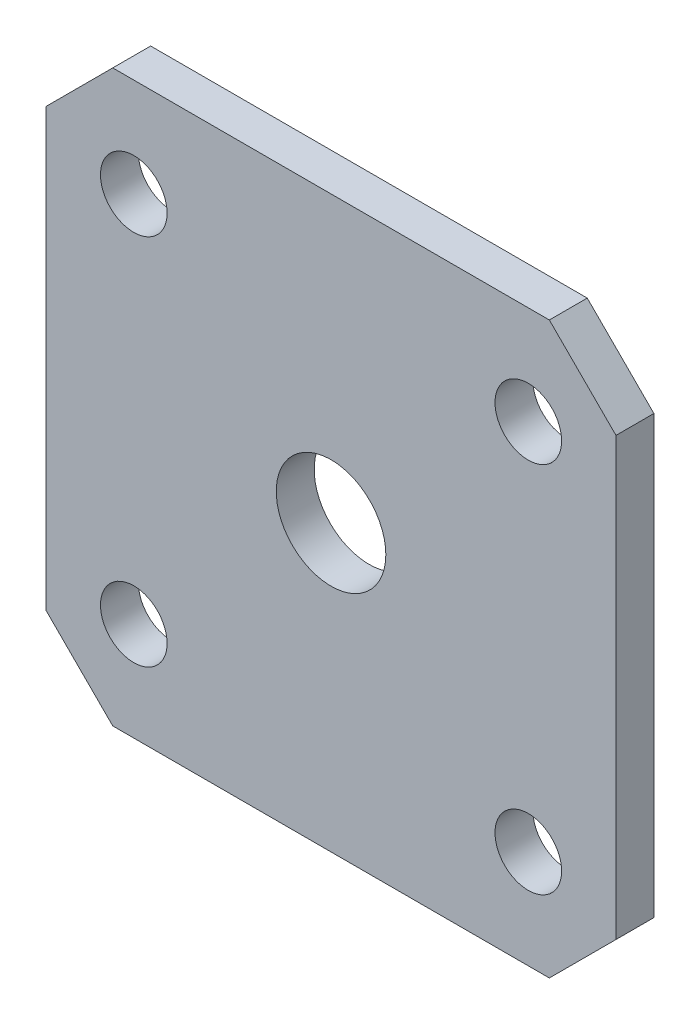
ISO-10303-21;
HEADER;
FILE_DESCRIPTION(('STEP AP214'),'2;1');
FILE_NAME('part.step','',(''),(''),'','','');
FILE_SCHEMA(('AUTOMOTIVE_DESIGN { 1 0 10303 214 1 1 1 1 }'));
ENDSEC;
DATA;
#1=APPLICATION_CONTEXT('core data for automotive mechanical design processes');
#2=APPLICATION_PROTOCOL_DEFINITION('international standard','automotive_design',2000,#1);
#3=PRODUCT_CONTEXT('',#1,'mechanical');
#4=PRODUCT('Part','Part','',(#3));
#5=PRODUCT_RELATED_PRODUCT_CATEGORY('part','',(#4));
#6=PRODUCT_DEFINITION_FORMATION('','',#4);
#7=PRODUCT_DEFINITION_CONTEXT('part definition',#1,'design');
#8=PRODUCT_DEFINITION('design','',#6,#7);
#9=PRODUCT_DEFINITION_SHAPE('','',#8);
#10=(LENGTH_UNIT() NAMED_UNIT(*) SI_UNIT(.MILLI.,.METRE.));
#11=(NAMED_UNIT(*) PLANE_ANGLE_UNIT() SI_UNIT($,.RADIAN.));
#12=(NAMED_UNIT(*) SI_UNIT($,.STERADIAN.) SOLID_ANGLE_UNIT());
#13=UNCERTAINTY_MEASURE_WITH_UNIT(LENGTH_MEASURE(1.E-05),#10,'distance_accuracy_value','');
#14=(GEOMETRIC_REPRESENTATION_CONTEXT(3) GLOBAL_UNCERTAINTY_ASSIGNED_CONTEXT((#13)) GLOBAL_UNIT_ASSIGNED_CONTEXT((#10,
#11,#12)) REPRESENTATION_CONTEXT('',''));
#15=CARTESIAN_POINT('',(0.,0.,0.));
#16=DIRECTION('',(0.,0.,1.));
#17=DIRECTION('',(1.,0.,0.));
#18=AXIS2_PLACEMENT_3D('',#15,#16,#17);
#19=CARTESIAN_POINT('',(147.914199961584,304.776937280457,-0.666205528065678));
#20=DIRECTION('',(1.,0.,0.));
#21=DIRECTION('',(0.,0.,-1.));
#22=AXIS2_PLACEMENT_3D('',#19,#20,#21);
#23=PLANE('',#22);
#24=DIRECTION('',(0.,1.,0.));
#25=VECTOR('',#24,1.);
#26=CARTESIAN_POINT('',(147.914199961584,304.776937280457,-0.666205528065678));
#27=LINE('',#26,#25);
#28=CARTESIAN_POINT('',(147.914199961584,314.428937280457,-0.666205528065678));
#29=VERTEX_POINT('',#28);
#30=CARTESIAN_POINT('',(147.914199961584,377.674937280457,-0.666205528065678));
#31=VERTEX_POINT('',#30);
#32=EDGE_CURVE('E158',#29,#31,#27,.T.);
#33=ORIENTED_EDGE('',*,*,#32,.T.);
#34=DIRECTION('',(0.,0.,1.));
#35=VECTOR('',#34,1.);
#36=CARTESIAN_POINT('',(147.914199961584,377.674937280457,-0.666205528065678));
#37=LINE('',#36,#35);
#38=CARTESIAN_POINT('',(147.914199961584,377.674937280457,4.82599999999943));
#39=VERTEX_POINT('',#38);
#40=EDGE_CURVE('E11',#31,#39,#37,.T.);
#41=ORIENTED_EDGE('',*,*,#40,.T.);
#42=DIRECTION('',(0.,1.,0.));
#43=VECTOR('',#42,1.);
#44=CARTESIAN_POINT('',(147.914199961584,304.776937280457,4.82599999999943));
#45=LINE('',#44,#43);
#46=CARTESIAN_POINT('',(147.914199961584,314.428937280457,4.82599999999943));
#47=VERTEX_POINT('',#46);
#48=EDGE_CURVE('E161',#47,#39,#45,.T.);
#49=ORIENTED_EDGE('',*,*,#48,.F.);
#50=DIRECTION('',(0.,0.,-1.));
#51=VECTOR('',#50,1.);
#52=CARTESIAN_POINT('',(147.914199961584,314.428937280457,-0.666205528065678));
#53=LINE('',#52,#51);
#54=EDGE_CURVE('E45',#47,#29,#53,.T.);
#55=ORIENTED_EDGE('',*,*,#54,.T.);
#56=EDGE_LOOP('',(#33,#41,#49,#55));
#57=FACE_BOUND('',#56,.T.);
#58=ADVANCED_FACE('F37',(#57),#23,.T.);
#59=CARTESIAN_POINT('',(65.364199961584,304.776937280457,-0.666205528065678));
#60=DIRECTION('',(0.,-1.,0.));
#61=DIRECTION('',(0.,0.,-1.));
#62=AXIS2_PLACEMENT_3D('',#59,#60,#61);
#63=PLANE('',#62);
#64=DIRECTION('',(1.,0.,0.));
#65=VECTOR('',#64,1.);
#66=CARTESIAN_POINT('',(65.364199961584,304.776937280457,4.82599999999943));
#67=LINE('',#66,#65);
#68=CARTESIAN_POINT('',(75.0161999615841,304.776937280457,4.82599999999943));
#69=VERTEX_POINT('',#68);
#70=CARTESIAN_POINT('',(138.262199961584,304.776937280457,4.82599999999943));
#71=VERTEX_POINT('',#70);
#72=EDGE_CURVE('E124',#69,#71,#67,.T.);
#73=ORIENTED_EDGE('',*,*,#72,.F.);
#74=DIRECTION('',(0.,0.,-1.));
#75=VECTOR('',#74,1.);
#76=CARTESIAN_POINT('',(75.0161999615841,304.776937280457,-0.666205528065678));
#77=LINE('',#76,#75);
#78=CARTESIAN_POINT('',(75.0161999615841,304.776937280457,-0.666205528065678));
#79=VERTEX_POINT('',#78);
#80=EDGE_CURVE('E142',#69,#79,#77,.T.);
#81=ORIENTED_EDGE('',*,*,#80,.T.);
#82=DIRECTION('',(1.,0.,0.));
#83=VECTOR('',#82,1.);
#84=CARTESIAN_POINT('',(65.364199961584,304.776937280457,-0.666205528065678));
#85=LINE('',#84,#83);
#86=CARTESIAN_POINT('',(138.262199961584,304.776937280457,-0.666205528065678));
#87=VERTEX_POINT('',#86);
#88=EDGE_CURVE('E127',#79,#87,#85,.T.);
#89=ORIENTED_EDGE('',*,*,#88,.T.);
#90=DIRECTION('',(0.,0.,1.));
#91=VECTOR('',#90,1.);
#92=CARTESIAN_POINT('',(138.262199961584,304.776937280457,-0.666205528065678));
#93=LINE('',#92,#91);
#94=EDGE_CURVE('E139',#87,#71,#93,.T.);
#95=ORIENTED_EDGE('',*,*,#94,.T.);
#96=EDGE_LOOP('',(#73,#81,#89,#95));
#97=FACE_BOUND('',#96,.T.);
#98=ADVANCED_FACE('F174',(#97),#63,.T.);
#99=CARTESIAN_POINT('',(65.364199961584,304.776937280457,-0.666205528065678));
#100=DIRECTION('',(-1.,0.,0.));
#101=DIRECTION('',(0.,0.,1.));
#102=AXIS2_PLACEMENT_3D('',#99,#100,#101);
#103=PLANE('',#102);
#104=DIRECTION('',(0.,-1.,0.));
#105=VECTOR('',#104,1.);
#106=CARTESIAN_POINT('',(65.364199961584,304.776937280457,-0.666205528065678));
#107=LINE('',#106,#105);
#108=CARTESIAN_POINT('',(65.364199961584,377.674937280457,-0.666205528065678));
#109=VERTEX_POINT('',#108);
#110=CARTESIAN_POINT('',(65.364199961584,314.428937280457,-0.666205528065678));
#111=VERTEX_POINT('',#110);
#112=EDGE_CURVE('E132',#109,#111,#107,.T.);
#113=ORIENTED_EDGE('',*,*,#112,.T.);
#114=DIRECTION('',(0.,0.,1.));
#115=VECTOR('',#114,1.);
#116=CARTESIAN_POINT('',(65.364199961584,314.428937280457,-0.666205528065678));
#117=LINE('',#116,#115);
#118=CARTESIAN_POINT('',(65.364199961584,314.428937280457,4.82599999999943));
#119=VERTEX_POINT('',#118);
#120=EDGE_CURVE('E123',#111,#119,#117,.T.);
#121=ORIENTED_EDGE('',*,*,#120,.T.);
#122=DIRECTION('',(0.,-1.,0.));
#123=VECTOR('',#122,1.);
#124=CARTESIAN_POINT('',(65.364199961584,304.776937280457,4.82599999999943));
#125=LINE('',#124,#123);
#126=CARTESIAN_POINT('',(65.364199961584,377.674937280457,4.82599999999943));
#127=VERTEX_POINT('',#126);
#128=EDGE_CURVE('E108',#127,#119,#125,.T.);
#129=ORIENTED_EDGE('',*,*,#128,.F.);
#130=DIRECTION('',(0.,0.,-1.));
#131=VECTOR('',#130,1.);
#132=CARTESIAN_POINT('',(65.364199961584,377.674937280457,-0.666205528065678));
#133=LINE('',#132,#131);
#134=EDGE_CURVE('E121',#127,#109,#133,.T.);
#135=ORIENTED_EDGE('',*,*,#134,.T.);
#136=EDGE_LOOP('',(#113,#121,#129,#135));
#137=FACE_BOUND('',#136,.T.);
#138=ADVANCED_FACE('F120',(#137),#103,.T.);
#139=CARTESIAN_POINT('',(65.364199961584,387.326937280457,-0.666205528065678));
#140=DIRECTION('',(0.,1.,0.));
#141=DIRECTION('',(0.,0.,1.));
#142=AXIS2_PLACEMENT_3D('',#139,#140,#141);
#143=PLANE('',#142);
#144=DIRECTION('',(-1.,0.,0.));
#145=VECTOR('',#144,1.);
#146=CARTESIAN_POINT('',(65.364199961584,387.326937280457,-0.666205528065678));
#147=LINE('',#146,#145);
#148=CARTESIAN_POINT('',(138.262199961584,387.326937280457,-0.666205528065678));
#149=VERTEX_POINT('',#148);
#150=CARTESIAN_POINT('',(75.016199961584,387.326937280457,-0.666205528065678));
#151=VERTEX_POINT('',#150);
#152=EDGE_CURVE('E167',#149,#151,#147,.T.);
#153=ORIENTED_EDGE('',*,*,#152,.T.);
#154=DIRECTION('',(0.,0.,1.));
#155=VECTOR('',#154,1.);
#156=CARTESIAN_POINT('',(75.016199961584,387.326937280457,-0.666205528065678));
#157=LINE('',#156,#155);
#158=CARTESIAN_POINT('',(75.016199961584,387.326937280457,4.82599999999943));
#159=VERTEX_POINT('',#158);
#160=EDGE_CURVE('E152',#151,#159,#157,.T.);
#161=ORIENTED_EDGE('',*,*,#160,.T.);
#162=DIRECTION('',(-1.,0.,0.));
#163=VECTOR('',#162,1.);
#164=CARTESIAN_POINT('',(65.364199961584,387.326937280457,4.82599999999943));
#165=LINE('',#164,#163);
#166=CARTESIAN_POINT('',(138.262199961584,387.326937280457,4.82599999999943));
#167=VERTEX_POINT('',#166);
#168=EDGE_CURVE('E109',#167,#159,#165,.T.);
#169=ORIENTED_EDGE('',*,*,#168,.F.);
#170=DIRECTION('',(0.,0.,-1.));
#171=VECTOR('',#170,1.);
#172=CARTESIAN_POINT('',(138.262199961584,387.326937280457,-0.666205528065678));
#173=LINE('',#172,#171);
#174=EDGE_CURVE('E59',#167,#149,#173,.T.);
#175=ORIENTED_EDGE('',*,*,#174,.T.);
#176=EDGE_LOOP('',(#153,#161,#169,#175));
#177=FACE_BOUND('',#176,.T.);
#178=ADVANCED_FACE('F213',(#177),#143,.T.);
#179=CARTESIAN_POINT('',(0.,0.,-0.666205528065678));
#180=DIRECTION('',(0.,0.,-1.));
#181=DIRECTION('',(-1.,0.,0.));
#182=AXIS2_PLACEMENT_3D('',#179,#180,#181);
#183=PLANE('',#182);
#184=CARTESIAN_POINT('',(106.639199961584,346.051937280457,-0.666205528065678));
#185=DIRECTION('',(0.,0.,1.));
#186=DIRECTION('',(1.,0.,0.));
#187=AXIS2_PLACEMENT_3D('',#184,#185,#186);
#188=CIRCLE('',#187,7.93749999999999);
#189=CARTESIAN_POINT('',(114.576699961584,346.051937280457,-0.666205528065678));
#190=VERTEX_POINT('',#189);
#191=EDGE_CURVE('E176',#190,#190,#188,.T.);
#192=ORIENTED_EDGE('',*,*,#191,.T.);
#193=EDGE_LOOP('',(#192));
#194=FACE_BOUND('',#193,.T.);
#195=CARTESIAN_POINT('',(135.214199961584,319.064437280457,-0.666205528065678));
#196=DIRECTION('',(0.,0.,1.));
#197=DIRECTION('',(1.,0.,0.));
#198=AXIS2_PLACEMENT_3D('',#195,#196,#197);
#199=CIRCLE('',#198,4.82600000000002);
#200=CARTESIAN_POINT('',(140.040199961584,319.064437280457,-0.666205528065678));
#201=VERTEX_POINT('',#200);
#202=EDGE_CURVE('E179',#201,#201,#199,.T.);
#203=ORIENTED_EDGE('',*,*,#202,.T.);
#204=EDGE_LOOP('',(#203));
#205=FACE_BOUND('',#204,.T.);
#206=CARTESIAN_POINT('',(135.214199961584,373.039437280457,-0.666205528065678));
#207=DIRECTION('',(0.,0.,1.));
#208=DIRECTION('',(1.,0.,0.));
#209=AXIS2_PLACEMENT_3D('',#206,#207,#208);
#210=CIRCLE('',#209,4.82600000000002);
#211=CARTESIAN_POINT('',(140.040199961584,373.039437280457,-0.666205528065678));
#212=VERTEX_POINT('',#211);
#213=EDGE_CURVE('E185',#212,#212,#210,.T.);
#214=ORIENTED_EDGE('',*,*,#213,.T.);
#215=EDGE_LOOP('',(#214));
#216=FACE_BOUND('',#215,.T.);
#217=CARTESIAN_POINT('',(78.0641999615839,319.064437280457,-0.666205528065678));
#218=DIRECTION('',(0.,0.,1.));
#219=DIRECTION('',(1.,0.,0.));
#220=AXIS2_PLACEMENT_3D('',#217,#218,#219);
#221=CIRCLE('',#220,4.82600000000004);
#222=CARTESIAN_POINT('',(82.890199961584,319.064437280457,-0.666205528065678));
#223=VERTEX_POINT('',#222);
#224=EDGE_CURVE('E188',#223,#223,#221,.T.);
#225=ORIENTED_EDGE('',*,*,#224,.T.);
#226=EDGE_LOOP('',(#225));
#227=FACE_BOUND('',#226,.T.);
#228=CARTESIAN_POINT('',(78.0641999615839,373.039437280457,-0.666205528065678));
#229=DIRECTION('',(0.,0.,1.));
#230=DIRECTION('',(1.,0.,0.));
#231=AXIS2_PLACEMENT_3D('',#228,#229,#230);
#232=CIRCLE('',#231,4.82600000000002);
#233=CARTESIAN_POINT('',(82.890199961584,373.039437280457,-0.666205528065678));
#234=VERTEX_POINT('',#233);
#235=EDGE_CURVE('E168',#234,#234,#232,.T.);
#236=ORIENTED_EDGE('',*,*,#235,.T.);
#237=EDGE_LOOP('',(#236));
#238=FACE_BOUND('',#237,.T.);
#239=ORIENTED_EDGE('',*,*,#88,.F.);
#240=DIRECTION('',(0.707106781186552,-0.707106781186543,0.));
#241=VECTOR('',#240,1.);
#242=CARTESIAN_POINT('',(189.89656862102,189.896568621023,-0.666205528065678));
#243=LINE('',#242,#241);
#244=EDGE_CURVE('E149',#79,#111,#243,.F.);
#245=ORIENTED_EDGE('',*,*,#244,.T.);
#246=ORIENTED_EDGE('',*,*,#112,.F.);
#247=DIRECTION('',(-0.707106781186544,-0.707106781186551,0.));
#248=VECTOR('',#247,1.);
#249=CARTESIAN_POINT('',(-156.155368659436,156.155368659435,-0.666205528065678));
#250=LINE('',#249,#248);
#251=EDGE_CURVE('E52',#109,#151,#250,.F.);
#252=ORIENTED_EDGE('',*,*,#251,.T.);
#253=ORIENTED_EDGE('',*,*,#152,.F.);
#254=DIRECTION('',(-0.707106781186552,0.707106781186544,0.));
#255=VECTOR('',#254,1.);
#256=CARTESIAN_POINT('',(262.79456862102,262.794568621023,-0.666205528065678));
#257=LINE('',#256,#255);
#258=EDGE_CURVE('E146',#149,#31,#257,.F.);
#259=ORIENTED_EDGE('',*,*,#258,.T.);
#260=ORIENTED_EDGE('',*,*,#32,.F.);
#261=DIRECTION('',(0.707106781186544,0.707106781186551,0.));
#262=VECTOR('',#261,1.);
#263=CARTESIAN_POINT('',(-83.257368659436,83.2573686594352,-0.666205528065678));
#264=LINE('',#263,#262);
#265=EDGE_CURVE('E144',#29,#87,#264,.F.);
#266=ORIENTED_EDGE('',*,*,#265,.T.);
#267=EDGE_LOOP('',(#239,#245,#246,#252,#253,#259,#260,#266));
#268=FACE_BOUND('',#267,.T.);
#269=ADVANCED_FACE('F165',(#194,#205,#216,#227,#238,#268),#183,.T.);
#270=CARTESIAN_POINT('',(78.0641999615839,373.039437280457,-0.666205528065678));
#271=DIRECTION('',(0.,0.,1.));
#272=DIRECTION('',(1.,0.,0.));
#273=AXIS2_PLACEMENT_3D('',#270,#271,#272);
#274=CYLINDRICAL_SURFACE('',#273,4.82600000000002);
#275=ORIENTED_EDGE('',*,*,#235,.F.);
#276=EDGE_LOOP('',(#275));
#277=FACE_BOUND('',#276,.T.);
#278=CARTESIAN_POINT('',(78.0641999615839,373.039437280457,4.82599999999943));
#279=DIRECTION('',(0.,0.,1.));
#280=DIRECTION('',(1.,0.,0.));
#281=AXIS2_PLACEMENT_3D('',#278,#279,#280);
#282=CIRCLE('',#281,4.82600000000002);
#283=CARTESIAN_POINT('',(82.890199961584,373.039437280457,4.82599999999943));
#284=VERTEX_POINT('',#283);
#285=EDGE_CURVE('E258',#284,#284,#282,.T.);
#286=ORIENTED_EDGE('',*,*,#285,.T.);
#287=EDGE_LOOP('',(#286));
#288=FACE_BOUND('',#287,.T.);
#289=ADVANCED_FACE('F220',(#277,#288),#274,.F.);
#290=CARTESIAN_POINT('',(78.0641999615839,319.064437280457,-0.666205528065678));
#291=DIRECTION('',(0.,0.,1.));
#292=DIRECTION('',(1.,0.,0.));
#293=AXIS2_PLACEMENT_3D('',#290,#291,#292);
#294=CYLINDRICAL_SURFACE('',#293,4.82600000000004);
#295=ORIENTED_EDGE('',*,*,#224,.F.);
#296=EDGE_LOOP('',(#295));
#297=FACE_BOUND('',#296,.T.);
#298=CARTESIAN_POINT('',(78.0641999615839,319.064437280457,4.82599999999943));
#299=DIRECTION('',(0.,0.,1.));
#300=DIRECTION('',(1.,0.,0.));
#301=AXIS2_PLACEMENT_3D('',#298,#299,#300);
#302=CIRCLE('',#301,4.82600000000004);
#303=CARTESIAN_POINT('',(82.890199961584,319.064437280457,4.82599999999943));
#304=VERTEX_POINT('',#303);
#305=EDGE_CURVE('E255',#304,#304,#302,.T.);
#306=ORIENTED_EDGE('',*,*,#305,.T.);
#307=EDGE_LOOP('',(#306));
#308=FACE_BOUND('',#307,.T.);
#309=ADVANCED_FACE('F224',(#297,#308),#294,.F.);
#310=CARTESIAN_POINT('',(135.214199961584,373.039437280457,-0.666205528065678));
#311=DIRECTION('',(0.,0.,1.));
#312=DIRECTION('',(1.,0.,0.));
#313=AXIS2_PLACEMENT_3D('',#310,#311,#312);
#314=CYLINDRICAL_SURFACE('',#313,4.82600000000002);
#315=ORIENTED_EDGE('',*,*,#213,.F.);
#316=EDGE_LOOP('',(#315));
#317=FACE_BOUND('',#316,.T.);
#318=CARTESIAN_POINT('',(135.214199961584,373.039437280457,4.82599999999943));
#319=DIRECTION('',(0.,0.,1.));
#320=DIRECTION('',(1.,0.,0.));
#321=AXIS2_PLACEMENT_3D('',#318,#319,#320);
#322=CIRCLE('',#321,4.82600000000002);
#323=CARTESIAN_POINT('',(140.040199961584,373.039437280457,4.82599999999943));
#324=VERTEX_POINT('',#323);
#325=EDGE_CURVE('E250',#324,#324,#322,.T.);
#326=ORIENTED_EDGE('',*,*,#325,.T.);
#327=EDGE_LOOP('',(#326));
#328=FACE_BOUND('',#327,.T.);
#329=ADVANCED_FACE('F228',(#317,#328),#314,.F.);
#330=CARTESIAN_POINT('',(135.214199961584,319.064437280457,-0.666205528065678));
#331=DIRECTION('',(0.,0.,1.));
#332=DIRECTION('',(1.,0.,0.));
#333=AXIS2_PLACEMENT_3D('',#330,#331,#332);
#334=CYLINDRICAL_SURFACE('',#333,4.82600000000002);
#335=ORIENTED_EDGE('',*,*,#202,.F.);
#336=EDGE_LOOP('',(#335));
#337=FACE_BOUND('',#336,.T.);
#338=CARTESIAN_POINT('',(135.214199961584,319.064437280457,4.82599999999943));
#339=DIRECTION('',(0.,0.,1.));
#340=DIRECTION('',(1.,0.,0.));
#341=AXIS2_PLACEMENT_3D('',#338,#339,#340);
#342=CIRCLE('',#341,4.82600000000002);
#343=CARTESIAN_POINT('',(140.040199961584,319.064437280457,4.82599999999943));
#344=VERTEX_POINT('',#343);
#345=EDGE_CURVE('E247',#344,#344,#342,.T.);
#346=ORIENTED_EDGE('',*,*,#345,.T.);
#347=EDGE_LOOP('',(#346));
#348=FACE_BOUND('',#347,.T.);
#349=ADVANCED_FACE('F232',(#337,#348),#334,.F.);
#350=CARTESIAN_POINT('',(106.639199961584,346.051937280457,-0.666205528065678));
#351=DIRECTION('',(0.,0.,1.));
#352=DIRECTION('',(1.,0.,0.));
#353=AXIS2_PLACEMENT_3D('',#350,#351,#352);
#354=CYLINDRICAL_SURFACE('',#353,7.93749999999999);
#355=ORIENTED_EDGE('',*,*,#191,.F.);
#356=EDGE_LOOP('',(#355));
#357=FACE_BOUND('',#356,.T.);
#358=CARTESIAN_POINT('',(106.639199961584,346.051937280457,4.82599999999943));
#359=DIRECTION('',(0.,0.,1.));
#360=DIRECTION('',(1.,0.,0.));
#361=AXIS2_PLACEMENT_3D('',#358,#359,#360);
#362=CIRCLE('',#361,7.93749999999999);
#363=CARTESIAN_POINT('',(114.576699961584,346.051937280457,4.82599999999943));
#364=VERTEX_POINT('',#363);
#365=EDGE_CURVE('E245',#364,#364,#362,.T.);
#366=ORIENTED_EDGE('',*,*,#365,.T.);
#367=EDGE_LOOP('',(#366));
#368=FACE_BOUND('',#367,.T.);
#369=ADVANCED_FACE('F204',(#357,#368),#354,.F.);
#370=CARTESIAN_POINT('',(0.,0.,4.82599999999943));
#371=DIRECTION('',(0.,0.,-1.));
#372=DIRECTION('',(-1.,0.,0.));
#373=AXIS2_PLACEMENT_3D('',#370,#371,#372);
#374=PLANE('',#373);
#375=ORIENTED_EDGE('',*,*,#128,.T.);
#376=DIRECTION('',(-0.707106781186552,0.707106781186543,0.));
#377=VECTOR('',#376,1.);
#378=CARTESIAN_POINT('',(65.364199961584,314.428937280457,4.82599999999943));
#379=LINE('',#378,#377);
#380=EDGE_CURVE('E114',#119,#69,#379,.F.);
#381=ORIENTED_EDGE('',*,*,#380,.T.);
#382=ORIENTED_EDGE('',*,*,#72,.T.);
#383=DIRECTION('',(-0.707106781186544,-0.707106781186551,0.));
#384=VECTOR('',#383,1.);
#385=CARTESIAN_POINT('',(138.262199961584,304.776937280457,4.82599999999943));
#386=LINE('',#385,#384);
#387=EDGE_CURVE('E129',#71,#47,#386,.F.);
#388=ORIENTED_EDGE('',*,*,#387,.T.);
#389=ORIENTED_EDGE('',*,*,#48,.T.);
#390=DIRECTION('',(0.707106781186552,-0.707106781186544,0.));
#391=VECTOR('',#390,1.);
#392=CARTESIAN_POINT('',(147.914199961584,377.674937280457,4.82599999999943));
#393=LINE('',#392,#391);
#394=EDGE_CURVE('E115',#39,#167,#393,.F.);
#395=ORIENTED_EDGE('',*,*,#394,.T.);
#396=ORIENTED_EDGE('',*,*,#168,.T.);
#397=DIRECTION('',(0.707106781186544,0.707106781186551,0.));
#398=VECTOR('',#397,1.);
#399=CARTESIAN_POINT('',(75.016199961584,387.326937280457,4.82599999999943));
#400=LINE('',#399,#398);
#401=EDGE_CURVE('E104',#159,#127,#400,.F.);
#402=ORIENTED_EDGE('',*,*,#401,.T.);
#403=EDGE_LOOP('',(#375,#381,#382,#388,#389,#395,#396,#402));
#404=FACE_BOUND('',#403,.T.);
#405=ORIENTED_EDGE('',*,*,#285,.F.);
#406=EDGE_LOOP('',(#405));
#407=FACE_BOUND('',#406,.T.);
#408=ORIENTED_EDGE('',*,*,#305,.F.);
#409=EDGE_LOOP('',(#408));
#410=FACE_BOUND('',#409,.T.);
#411=ORIENTED_EDGE('',*,*,#325,.F.);
#412=EDGE_LOOP('',(#411));
#413=FACE_BOUND('',#412,.T.);
#414=ORIENTED_EDGE('',*,*,#345,.F.);
#415=EDGE_LOOP('',(#414));
#416=FACE_BOUND('',#415,.T.);
#417=ORIENTED_EDGE('',*,*,#365,.F.);
#418=EDGE_LOOP('',(#417));
#419=FACE_BOUND('',#418,.T.);
#420=ADVANCED_FACE('F106',(#404,#407,#410,#413,#416,#419),#374,.F.);
#421=CARTESIAN_POINT('',(65.364199961584,314.428937280457,-0.666205528065678));
#422=DIRECTION('',(0.707106781186543,0.707106781186552,0.));
#423=DIRECTION('',(0.,0.,1.));
#424=AXIS2_PLACEMENT_3D('',#421,#422,#423);
#425=PLANE('',#424);
#426=ORIENTED_EDGE('',*,*,#244,.F.);
#427=ORIENTED_EDGE('',*,*,#80,.F.);
#428=ORIENTED_EDGE('',*,*,#380,.F.);
#429=ORIENTED_EDGE('',*,*,#120,.F.);
#430=EDGE_LOOP('',(#426,#427,#428,#429));
#431=FACE_BOUND('',#430,.T.);
#432=ADVANCED_FACE('F195',(#431),#425,.F.);
#433=CARTESIAN_POINT('',(75.016199961584,387.326937280457,-0.666205528065678));
#434=DIRECTION('',(0.707106781186551,-0.707106781186544,0.));
#435=DIRECTION('',(0.,0.,1.));
#436=AXIS2_PLACEMENT_3D('',#433,#434,#435);
#437=PLANE('',#436);
#438=ORIENTED_EDGE('',*,*,#251,.F.);
#439=ORIENTED_EDGE('',*,*,#134,.F.);
#440=ORIENTED_EDGE('',*,*,#401,.F.);
#441=ORIENTED_EDGE('',*,*,#160,.F.);
#442=EDGE_LOOP('',(#438,#439,#440,#441));
#443=FACE_BOUND('',#442,.T.);
#444=ADVANCED_FACE('F126',(#443),#437,.F.);
#445=CARTESIAN_POINT('',(147.914199961584,377.674937280457,-0.666205528065678));
#446=DIRECTION('',(-0.707106781186544,-0.707106781186552,0.));
#447=DIRECTION('',(0.,0.,1.));
#448=AXIS2_PLACEMENT_3D('',#445,#446,#447);
#449=PLANE('',#448);
#450=ORIENTED_EDGE('',*,*,#258,.F.);
#451=ORIENTED_EDGE('',*,*,#174,.F.);
#452=ORIENTED_EDGE('',*,*,#394,.F.);
#453=ORIENTED_EDGE('',*,*,#40,.F.);
#454=EDGE_LOOP('',(#450,#451,#452,#453));
#455=FACE_BOUND('',#454,.T.);
#456=ADVANCED_FACE('F202',(#455),#449,.F.);
#457=CARTESIAN_POINT('',(138.262199961584,304.776937280457,-0.666205528065678));
#458=DIRECTION('',(-0.707106781186551,0.707106781186544,0.));
#459=DIRECTION('',(0.,0.,1.));
#460=AXIS2_PLACEMENT_3D('',#457,#458,#459);
#461=PLANE('',#460);
#462=ORIENTED_EDGE('',*,*,#265,.F.);
#463=ORIENTED_EDGE('',*,*,#54,.F.);
#464=ORIENTED_EDGE('',*,*,#387,.F.);
#465=ORIENTED_EDGE('',*,*,#94,.F.);
#466=EDGE_LOOP('',(#462,#463,#464,#465));
#467=FACE_BOUND('',#466,.T.);
#468=ADVANCED_FACE('F39',(#467),#461,.F.);
#469=CLOSED_SHELL('',(#58,#98,#138,#178,#269,#289,#309,#329,#349,#369,#420,#432,#444,#456,#468));
#470=MANIFOLD_SOLID_BREP('B2',#469);
#471=ADVANCED_BREP_SHAPE_REPRESENTATION('',(#18,#470),#14);
#472=SHAPE_DEFINITION_REPRESENTATION(#9,#471);
ENDSEC;
END-ISO-10303-21;
